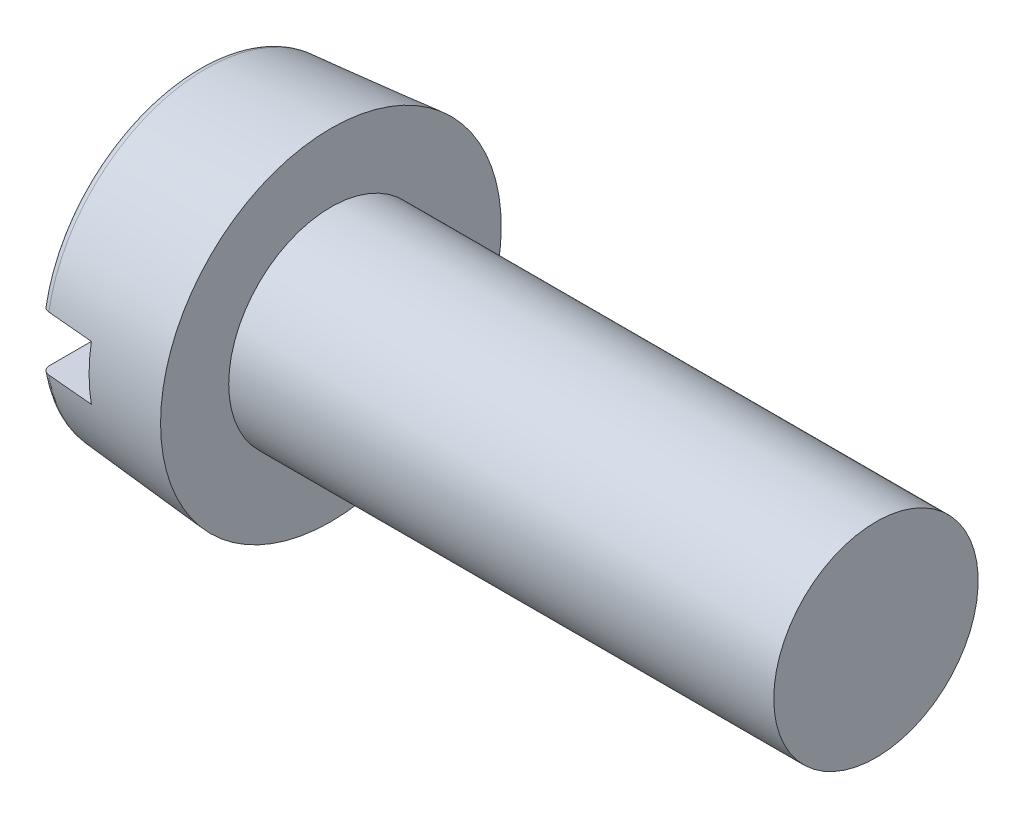
ISO-10303-21;
HEADER;
FILE_DESCRIPTION(('STEP AP214'),'2;1');
FILE_NAME('part.step','',(''),(''),'','','');
FILE_SCHEMA(('AUTOMOTIVE_DESIGN { 1 0 10303 214 1 1 1 1 }'));
ENDSEC;
DATA;
#1=APPLICATION_CONTEXT('core data for automotive mechanical design processes');
#2=APPLICATION_PROTOCOL_DEFINITION('international standard','automotive_design',2000,#1);
#3=PRODUCT_CONTEXT('',#1,'mechanical');
#4=PRODUCT('Part','Part','',(#3));
#5=PRODUCT_RELATED_PRODUCT_CATEGORY('part','',(#4));
#6=PRODUCT_DEFINITION_FORMATION('','',#4);
#7=PRODUCT_DEFINITION_CONTEXT('part definition',#1,'design');
#8=PRODUCT_DEFINITION('design','',#6,#7);
#9=PRODUCT_DEFINITION_SHAPE('','',#8);
#10=(LENGTH_UNIT() NAMED_UNIT(*) SI_UNIT(.MILLI.,.METRE.));
#11=(NAMED_UNIT(*) PLANE_ANGLE_UNIT() SI_UNIT($,.RADIAN.));
#12=(NAMED_UNIT(*) SI_UNIT($,.STERADIAN.) SOLID_ANGLE_UNIT());
#13=UNCERTAINTY_MEASURE_WITH_UNIT(LENGTH_MEASURE(1.E-05),#10,'distance_accuracy_value','');
#14=(GEOMETRIC_REPRESENTATION_CONTEXT(3) GLOBAL_UNCERTAINTY_ASSIGNED_CONTEXT((#13)) GLOBAL_UNIT_ASSIGNED_CONTEXT((#10,
#11,#12)) REPRESENTATION_CONTEXT('',''));
#15=CARTESIAN_POINT('',(0.,0.,0.));
#16=DIRECTION('',(0.,0.,1.));
#17=DIRECTION('',(1.,0.,0.));
#18=AXIS2_PLACEMENT_3D('',#15,#16,#17);
#19=CARTESIAN_POINT('',(0.,0.,0.));
#20=DIRECTION('',(-1.,0.,0.));
#21=DIRECTION('',(0.,0.,1.));
#22=AXIS2_PLACEMENT_3D('',#19,#20,#21);
#23=PLANE('',#22);
#24=DIRECTION('',(0.,0.,-1.));
#25=VECTOR('',#24,1.);
#26=CARTESIAN_POINT('',(0.,0.799999999999999,5.));
#27=LINE('',#26,#25);
#28=CARTESIAN_POINT('',(0.,0.799999999999999,4.35687310503253));
#29=VERTEX_POINT('',#28);
#30=CARTESIAN_POINT('',(0.,0.799999999999999,-4.35687310503253));
#31=VERTEX_POINT('',#30);
#32=EDGE_CURVE('E105',#29,#31,#27,.T.);
#33=ORIENTED_EDGE('',*,*,#32,.F.);
#34=CARTESIAN_POINT('',(0.,0.,0.));
#35=DIRECTION('',(-1.,0.,0.));
#36=DIRECTION('',(0.,0.,1.));
#37=AXIS2_PLACEMENT_3D('',#34,#35,#36);
#38=CIRCLE('',#37,4.42971141874454);
#39=EDGE_CURVE('E107',#29,#31,#38,.T.);
#40=ORIENTED_EDGE('',*,*,#39,.T.);
#41=EDGE_LOOP('',(#33,#40));
#42=FACE_BOUND('',#41,.T.);
#43=ADVANCED_FACE('F36',(#42),#23,.T.);
#44=CARTESIAN_POINT('',(0.25,0.,0.));
#45=DIRECTION('',(-1.,0.,0.));
#46=DIRECTION('',(0.,0.,1.));
#47=AXIS2_PLACEMENT_3D('',#44,#45,#46);
#48=TOROIDAL_SURFACE('',#47,4.42971141874454,0.25);
#49=CARTESIAN_POINT('',(0.0843745139673016,0.799999999999999,-4.54713884753507));
#50=CARTESIAN_POINT('',(0.0947664586995602,0.799999999999999,-4.55647032525832));
#51=CARTESIAN_POINT('',(0.105945556691333,0.799999999999999,-4.56493903416212));
#52=CARTESIAN_POINT('',(0.129572716117704,0.799999999999999,-4.57989140862462));
#53=CARTESIAN_POINT('',(0.142022072161515,0.799999999999999,-4.58637302150944));
#54=CARTESIAN_POINT('',(0.167836656476817,0.799999999999999,-4.59714683325514));
#55=CARTESIAN_POINT('',(0.181201893013989,0.799999999999999,-4.60143901235377));
#56=CARTESIAN_POINT('',(0.20846295764934,0.799999999999999,-4.60769903597875));
#57=CARTESIAN_POINT('',(0.222358659502298,0.799999999999999,-4.60966743002539));
#58=CARTESIAN_POINT('',(0.250184670786079,0.799999999999999,-4.61121508700367));
#59=CARTESIAN_POINT('',(0.264114057095527,0.799999999999999,-4.61081097718474));
#60=CARTESIAN_POINT('',(0.291706289815914,0.799999999999999,-4.60766484478998));
#61=CARTESIAN_POINT('',(0.305369133587018,0.799999999999999,-4.60492279907126));
#62=CARTESIAN_POINT('',(0.33201528451889,0.799999999999999,-4.59719244659683));
#63=CARTESIAN_POINT('',(0.344999823284425,0.799999999999999,-4.59220838100316));
#64=CARTESIAN_POINT('',(0.36995602218756,0.799999999999999,-4.58014586647358));
#65=CARTESIAN_POINT('',(0.381927659652834,0.799999999999999,-4.57306737067284));
#66=CARTESIAN_POINT('',(0.404612434873794,0.799999999999999,-4.55696870724489));
#67=CARTESIAN_POINT('',(0.415316087301104,0.799999999999999,-4.54793517957388));
#68=CARTESIAN_POINT('',(0.435079629465306,0.799999999999999,-4.52822088199051));
#69=CARTESIAN_POINT('',(0.444139418595433,0.799999999999999,-4.51754001133239));
#70=CARTESIAN_POINT('',(0.460489239519099,0.799999999999999,-4.49468258218373));
#71=CARTESIAN_POINT('',(0.467753926150522,0.799999999999999,-4.48248789714714));
#72=CARTESIAN_POINT('',(0.480167350703522,0.799999999999999,-4.45706552825457));
#73=CARTESIAN_POINT('',(0.485315918386262,0.799999999999999,-4.44383776139041));
#74=CARTESIAN_POINT('',(0.493428565915992,0.799999999999999,-4.41651528125603));
#75=CARTESIAN_POINT('',(0.496359238222009,0.799999999999999,-4.40241064489389));
#76=CARTESIAN_POINT('',(0.499837523289973,0.799999999999999,-4.37391034921859));
#77=CARTESIAN_POINT('',(0.500384976210146,0.799999999999999,-4.35951467045037));
#78=CARTESIAN_POINT('',(0.499078446804455,0.799999999999999,-4.33068498215024));
#79=CARTESIAN_POINT('',(0.497199920280432,0.799999999999999,-4.31625207858808));
#80=CARTESIAN_POINT('',(0.491048786733969,0.799999999999999,-4.28790520901004));
#81=CARTESIAN_POINT('',(0.48677612267996,0.799999999999999,-4.27399125536466));
#82=CARTESIAN_POINT('',(0.47594460281427,0.799999999999999,-4.24707147808806));
#83=CARTESIAN_POINT('',(0.4693841583704,0.799999999999999,-4.23406629305718));
#84=CARTESIAN_POINT('',(0.454151641913421,0.799999999999999,-4.20935689397773));
#85=CARTESIAN_POINT('',(0.445479657663901,0.799999999999999,-4.19765262588758));
#86=CARTESIAN_POINT('',(0.426358586950534,0.799999999999999,-4.17601044610535));
#87=CARTESIAN_POINT('',(0.41592848359485,0.799999999999999,-4.16605577092361));
#88=CARTESIAN_POINT('',(0.393519785112439,0.799999999999999,-4.14807567025203));
#89=CARTESIAN_POINT('',(0.381541338548615,0.799999999999999,-4.14005005988019));
#90=CARTESIAN_POINT('',(0.356595306086814,0.799999999999999,-4.12630319751251));
#91=CARTESIAN_POINT('',(0.343648161289385,0.799999999999999,-4.12054485264621));
#92=CARTESIAN_POINT('',(0.316960794982865,0.799999999999999,-4.11132354564935));
#93=CARTESIAN_POINT('',(0.303220653730743,0.799999999999999,-4.10786035167426));
#94=CARTESIAN_POINT('',(0.275571496586555,0.799999999999999,-4.10337797513435));
#95=CARTESIAN_POINT('',(0.261668611402135,0.799999999999999,-4.10232091647946));
#96=CARTESIAN_POINT('',(0.233884694824703,0.799999999999999,-4.10257279191194));
#97=CARTESIAN_POINT('',(0.220003662337756,0.799999999999999,-4.10388160353476));
#98=CARTESIAN_POINT('',(0.192750847226188,0.799999999999999,-4.10880691438427));
#99=CARTESIAN_POINT('',(0.17937635175152,0.799999999999999,-4.11240843459997));
#100=CARTESIAN_POINT('',(0.153416340687042,0.799999999999999,-4.1217924272919));
#101=CARTESIAN_POINT('',(0.140830838036522,0.799999999999999,-4.12757493552489));
#102=CARTESIAN_POINT('',(0.116718702845362,0.799999999999999,-4.14118635319511));
#103=CARTESIAN_POINT('',(0.105199031535416,0.799999999999999,-4.14902758560239));
#104=CARTESIAN_POINT('',(0.0836139601475573,0.799999999999999,-4.16650536788752));
#105=CARTESIAN_POINT('',(0.0735486675995981,0.799999999999999,-4.17614205039207));
#106=CARTESIAN_POINT('',(0.0549906068780776,0.799999999999999,-4.19709392533343));
#107=CARTESIAN_POINT('',(0.0465244660482462,0.799999999999999,-4.20843269854749));
#108=CARTESIAN_POINT('',(0.0315779805542522,0.799999999999999,-4.23235098665425));
#109=CARTESIAN_POINT('',(0.0250978218784058,0.799999999999999,-4.24493061760823));
#110=CARTESIAN_POINT('',(0.0141935733015743,0.799999999999999,-4.27120525538031));
#111=CARTESIAN_POINT('',(0.00980663137929339,0.799999999999999,-4.28491568506915));
#112=CARTESIAN_POINT('',(0.00336858262139434,0.799999999999999,-4.31287408475846));
#113=CARTESIAN_POINT('',(0.00131755321712989,0.799999999999999,-4.32712207256186));
#114=CARTESIAN_POINT('',(-0.000404743229666968,0.799999999999999,-4.35591815094775));
#115=CARTESIAN_POINT('',(-4.97415160945771E-05,0.799999999999999,-4.37046781945822));
#116=CARTESIAN_POINT('',(0.00309634160915894,0.799999999999999,-4.39930578468791));
#117=CARTESIAN_POINT('',(0.005888065533615,0.799999999999999,-4.41359401145582));
#118=CARTESIAN_POINT('',(0.0138414796333788,0.799999999999999,-4.44150971841821));
#119=CARTESIAN_POINT('',(0.019005534533352,0.799999999999999,-4.45513652429213));
#120=CARTESIAN_POINT('',(0.0315669495689906,0.799999999999999,-4.48130546011623));
#121=CARTESIAN_POINT('',(0.038961552999586,0.799999999999999,-4.49384890450362));
#122=CARTESIAN_POINT('',(0.0527483231198187,0.799999999999999,-4.51322888535915));
#123=CARTESIAN_POINT('',(0.0585453744336813,0.799999999999999,-4.52049608241621));
#124=CARTESIAN_POINT('',(0.0709038030597203,0.799999999999999,-4.53434893015065));
#125=CARTESIAN_POINT('',(0.0774651747689887,0.799999999999999,-4.54093458582347));
#126=CARTESIAN_POINT('',(0.0843745139673016,0.799999999999999,-4.54713884753507));
#127=B_SPLINE_CURVE_WITH_KNOTS('',3,(#49,#50,#51,#52,#53,#54,#55,#56,#57,#58,#59,#60,#61,#62,
#63,#64,#65,#66,#67,#68,#69,#70,#71,#72,#73,#74,#75,#76,#77,#78,#79,#80,#81,#82,#83,#84,#85,#86,
#87,#88,#89,#90,#91,#92,#93,#94,#95,#96,#97,#98,#99,#100,#101,#102,#103,#104,#105,#106,#107,
#108,#109,#110,#111,#112,#113,#114,#115,#116,#117,#118,#119,#120,#121,#122,#123,#124,#125,#126),
.UNSPECIFIED.,.T.,.F.,(4,2,2,2,2,2,2,2,2,2,2,2,2,2,2,2,2,2,2,2,2,2,2,2,2,2,2,2,2,2,2,2,2,2,2,2,
2,2,4),(0.,0.0418667869734222,0.0837766778115482,0.125686946929814,0.16758730327269,
0.209194360972177,0.250801830538735,0.292330921340791,0.333860941465457,0.375684268578897,
0.417510154476528,0.459896582852511,0.502286420490785,0.545302709439979,0.588321883433682,
0.631779721081862,0.675238593998068,0.718727704998099,0.762215008734482,0.805259756204676,
0.848300376610336,0.890604257880895,0.93290386517574,0.974532868910495,1.01615971786478,
1.05751735778502,1.0988756757831,1.1404874327479,1.18210226471861,1.22435848197869,
1.26661865534824,1.30960322784671,1.35258922516599,1.39604528862763,1.43951281400867,
1.48302376187616,1.52648115394825,1.55431751761326,1.58215367723456),.UNSPECIFIED.);
#128=CARTESIAN_POINT('',(0.228211064313089,0.799999999999999,-4.60985856728298));
#129=VERTEX_POINT('',#128);
#130=EDGE_CURVE('E60',#31,#129,#127,.T.);
#131=ORIENTED_EDGE('',*,*,#130,.F.);
#132=ORIENTED_EDGE('',*,*,#39,.F.);
#133=CARTESIAN_POINT('',(0.0959001813107435,0.799999999999999,4.15656641103332));
#134=CARTESIAN_POINT('',(0.106788415825711,0.799999999999999,4.14788745461773));
#135=CARTESIAN_POINT('',(0.118407944179667,0.799999999999999,4.14011141325745));
#136=CARTESIAN_POINT('',(0.142793418088751,0.799999999999999,4.12660779391372));
#137=CARTESIAN_POINT('',(0.1555604916501,0.799999999999999,4.1208822596904));
#138=CARTESIAN_POINT('',(0.181880372778501,0.799999999999999,4.11166457290373));
#139=CARTESIAN_POINT('',(0.195433261558838,0.799999999999999,4.10817265163254));
#140=CARTESIAN_POINT('',(0.22293177574204,0.799999999999999,4.10353646607757));
#141=CARTESIAN_POINT('',(0.236877307119585,0.799999999999999,4.10239164450505));
#142=CARTESIAN_POINT('',(0.264645946049344,0.799999999999999,4.10248426879624));
#143=CARTESIAN_POINT('',(0.278469121771725,0.799999999999999,4.10370230145962));
#144=CARTESIAN_POINT('',(0.305714231255908,0.799999999999999,4.10844337723671));
#145=CARTESIAN_POINT('',(0.319136158921659,0.799999999999999,4.11196645535176));
#146=CARTESIAN_POINT('',(0.345196190898692,0.799999999999999,4.12120519851656));
#147=CARTESIAN_POINT('',(0.357834594953027,0.799999999999999,4.12692001901016));
#148=CARTESIAN_POINT('',(0.381987358781024,0.799999999999999,4.14036736287849));
#149=CARTESIAN_POINT('',(0.393501667695256,0.799999999999999,4.14809997748976));
#150=CARTESIAN_POINT('',(0.415223323770805,0.799999999999999,4.16545218138983));
#151=CARTESIAN_POINT('',(0.425414331301238,0.799999999999999,4.1750922160513));
#152=CARTESIAN_POINT('',(0.444067043476819,0.799999999999999,4.19592046549653));
#153=CARTESIAN_POINT('',(0.452528600639199,0.799999999999999,4.20710881217976));
#154=CARTESIAN_POINT('',(0.467637257703406,0.799999999999999,4.23092308558754));
#155=CARTESIAN_POINT('',(0.474250444884052,0.799999999999999,4.24357052897649));
#156=CARTESIAN_POINT('',(0.485295923870393,0.799999999999999,4.26978437529861));
#157=CARTESIAN_POINT('',(0.489728024878825,0.799999999999999,4.28335085850958));
#158=CARTESIAN_POINT('',(0.496348686228484,0.799999999999999,4.31123668386873));
#159=CARTESIAN_POINT('',(0.498502538073368,0.799999999999999,4.32556427489857));
#160=CARTESIAN_POINT('',(0.500390966396856,0.799999999999999,4.35437836821249));
#161=CARTESIAN_POINT('',(0.500125424907182,0.799999999999999,4.36886487821098));
#162=CARTESIAN_POINT('',(0.49716991446228,0.799999999999999,4.39768046074187));
#163=CARTESIAN_POINT('',(0.494464847017555,0.799999999999999,4.41200798953149));
#164=CARTESIAN_POINT('',(0.48667671393226,0.799999999999999,4.44000204463693));
#165=CARTESIAN_POINT('',(0.481593671098545,0.799999999999999,4.45366857729088));
#166=CARTESIAN_POINT('',(0.469211071617953,0.799999999999999,4.47988055882434));
#167=CARTESIAN_POINT('',(0.461921932889214,0.799999999999999,4.49243092577483));
#168=CARTESIAN_POINT('',(0.445314277109358,0.799999999999999,4.51610885304479));
#169=CARTESIAN_POINT('',(0.435995887681564,0.799999999999999,4.52723650277175));
#170=CARTESIAN_POINT('',(0.415719339948153,0.799999999999999,4.54759847674213));
#171=CARTESIAN_POINT('',(0.40478366018556,0.799999999999999,4.55685518051455));
#172=CARTESIAN_POINT('',(0.381493322866437,0.799999999999999,4.57336755721764));
#173=CARTESIAN_POINT('',(0.369138787325294,0.799999999999999,4.58062340203119));
#174=CARTESIAN_POINT('',(0.343562076099289,0.799999999999999,4.59281384530927));
#175=CARTESIAN_POINT('',(0.330355796776961,0.799999999999999,4.59778180297204));
#176=CARTESIAN_POINT('',(0.303291234624968,0.799999999999999,4.60540157532454));
#177=CARTESIAN_POINT('',(0.289432998788489,0.799999999999999,4.60805355668166));
#178=CARTESIAN_POINT('',(0.261624724399412,0.799999999999999,4.61094190214969));
#179=CARTESIAN_POINT('',(0.247677460008665,0.799999999999999,4.61120503296629));
#180=CARTESIAN_POINT('',(0.219938315263379,0.799999999999999,4.60937765777905));
#181=CARTESIAN_POINT('',(0.206146430136893,0.799999999999999,4.60728722425708));
#182=CARTESIAN_POINT('',(0.179153987168141,0.799999999999999,4.60082770933504));
#183=CARTESIAN_POINT('',(0.165951690867308,0.799999999999999,4.59646588382979));
#184=CARTESIAN_POINT('',(0.140460643506912,0.799999999999999,4.58560026694177));
#185=CARTESIAN_POINT('',(0.128171907706466,0.799999999999999,4.57909643979119));
#186=CARTESIAN_POINT('',(0.10477557572249,0.799999999999999,4.56409626270254));
#187=CARTESIAN_POINT('',(0.0936753626978237,0.799999999999999,4.55558840254583));
#188=CARTESIAN_POINT('',(0.0730382927080419,0.799999999999999,4.53685140871141));
#189=CARTESIAN_POINT('',(0.0635015296880057,0.799999999999999,4.52662217167386));
#190=CARTESIAN_POINT('',(0.0461300651497456,0.799999999999999,4.50459510365438));
#191=CARTESIAN_POINT('',(0.0383186413286125,0.799999999999999,4.49277891845132));
#192=CARTESIAN_POINT('',(0.0247564031853251,0.799999999999999,4.46801811991763));
#193=CARTESIAN_POINT('',(0.0190057551793424,0.799999999999999,4.45507341561395));
#194=CARTESIAN_POINT('',(0.00963931307658738,0.799999999999999,4.42821566315949));
#195=CARTESIAN_POINT('',(0.00605674159024491,0.799999999999999,4.41429102608576));
#196=CARTESIAN_POINT('',(0.0012515332492651,0.799999999999999,4.38604074185308));
#197=CARTESIAN_POINT('',(2.8974540943668E-05,0.799999999999999,4.37171508143111));
#198=CARTESIAN_POINT('',(-2.82690076872439E-05,0.799999999999999,4.34289966366282));
#199=CARTESIAN_POINT('',(0.00116367190061409,0.799999999999999,4.32840984797728));
#200=CARTESIAN_POINT('',(0.00595761948908729,0.799999999999999,4.29983005095994));
#201=CARTESIAN_POINT('',(0.00956028797955093,0.799999999999999,4.28574018053154));
#202=CARTESIAN_POINT('',(0.0190939091140281,0.799999999999999,4.25832934268385));
#203=CARTESIAN_POINT('',(0.0250311218028103,0.799999999999999,4.24501055399625));
#204=CARTESIAN_POINT('',(0.0390730747089435,0.799999999999999,4.21958282568064));
#205=CARTESIAN_POINT('',(0.0471751672784287,0.799999999999999,4.20747243286742));
#206=CARTESIAN_POINT('',(0.0620951603544308,0.799999999999999,4.1888427296012));
#207=CARTESIAN_POINT('',(0.0683488441377469,0.799999999999999,4.18186415048199));
#208=CARTESIAN_POINT('',(0.0815915898531068,0.799999999999999,4.1686431762696));
#209=CARTESIAN_POINT('',(0.0885806460321473,0.799999999999999,4.16240077541792));
#210=CARTESIAN_POINT('',(0.0959001813107435,0.799999999999999,4.15656641103332));
#211=B_SPLINE_CURVE_WITH_KNOTS('',3,(#133,#134,#135,#136,#137,#138,#139,#140,#141,#142,#143,
#144,#145,#146,#147,#148,#149,#150,#151,#152,#153,#154,#155,#156,#157,#158,#159,#160,#161,#162,
#163,#164,#165,#166,#167,#168,#169,#170,#171,#172,#173,#174,#175,#176,#177,#178,#179,#180,#181,
#182,#183,#184,#185,#186,#187,#188,#189,#190,#191,#192,#193,#194,#195,#196,#197,#198,#199,#200,
#201,#202,#203,#204,#205,#206,#207,#208,#209,#210),.UNSPECIFIED.,.T.,.F.,(4,2,2,2,2,2,2,2,2,2,2,
2,2,2,2,2,2,2,2,2,2,2,2,2,2,2,2,2,2,2,2,2,2,2,2,2,2,2,4),(0.,0.0417385272571555,
0.0835185406796224,0.125302879751477,0.167077296518138,0.208509948086357,0.249943228809956,
0.291360559834956,0.332779763910084,0.374669665166324,0.416563137188986,0.45918117047002,
0.501802931232992,0.545065061503765,0.588329301223336,0.631863159585299,0.675396600428199,
0.718727587294531,0.762055849781762,0.804830369249996,0.847601213047327,0.889726974282855,
0.931849703721539,0.973499863801072,1.01514874123079,1.0566653813861,1.09818271483433,
1.13994458301147,1.18170895966993,1.22400639230702,1.26630723781588,1.30924087081592,
1.35217592543865,1.39558702078537,1.43901003855051,1.48255029735413,1.52603754824063,
1.55409618457985,1.58215460142562),.UNSPECIFIED.);
#212=CARTESIAN_POINT('',(0.228211064304484,0.799999999999999,4.60985856731615));
#213=VERTEX_POINT('',#212);
#214=EDGE_CURVE('E97',#213,#29,#211,.T.);
#215=ORIENTED_EDGE('',*,*,#214,.F.);
#216=CARTESIAN_POINT('',(0.228211064313089,0.,0.));
#217=DIRECTION('',(-1.,0.,0.));
#218=DIRECTION('',(0.,0.,1.));
#219=AXIS2_PLACEMENT_3D('',#216,#217,#218);
#220=CIRCLE('',#219,4.67876009326748);
#221=EDGE_CURVE('E111',#129,#213,#220,.F.);
#222=ORIENTED_EDGE('',*,*,#221,.F.);
#223=EDGE_LOOP('',(#131,#132,#215,#222));
#224=FACE_BOUND('',#223,.T.);
#225=ADVANCED_FACE('F188',(#224),#48,.T.);
#226=CARTESIAN_POINT('',(-25.4,0.,0.));
#227=DIRECTION('',(-1.,0.,0.));
#228=DIRECTION('',(0.,0.,1.));
#229=AXIS2_PLACEMENT_3D('',#226,#227,#228);
#230=CYLINDRICAL_SURFACE('',#229,3.);
#231=CARTESIAN_POINT('',(19.9,0.,0.));
#232=DIRECTION('',(-1.,0.,0.));
#233=DIRECTION('',(0.,0.,1.));
#234=AXIS2_PLACEMENT_3D('',#231,#232,#233);
#235=CIRCLE('',#234,3.);
#236=CARTESIAN_POINT('',(19.9,0.,3.));
#237=VERTEX_POINT('',#236);
#238=EDGE_CURVE('E108',#237,#237,#235,.T.);
#239=ORIENTED_EDGE('',*,*,#238,.T.);
#240=EDGE_LOOP('',(#239));
#241=FACE_BOUND('',#240,.T.);
#242=CARTESIAN_POINT('',(3.9,0.,0.));
#243=DIRECTION('',(-1.,0.,0.));
#244=DIRECTION('',(0.,0.,1.));
#245=AXIS2_PLACEMENT_3D('',#242,#243,#244);
#246=CIRCLE('',#245,3.);
#247=CARTESIAN_POINT('',(3.9,0.,3.));
#248=VERTEX_POINT('',#247);
#249=EDGE_CURVE('E175',#248,#248,#246,.T.);
#250=ORIENTED_EDGE('',*,*,#249,.F.);
#251=EDGE_LOOP('',(#250));
#252=FACE_BOUND('',#251,.T.);
#253=ADVANCED_FACE('F185',(#241,#252),#230,.T.);
#254=CARTESIAN_POINT('',(19.9,3.,0.));
#255=DIRECTION('',(1.,0.,0.));
#256=DIRECTION('',(0.,0.,-1.));
#257=AXIS2_PLACEMENT_3D('',#254,#255,#256);
#258=PLANE('',#257);
#259=ORIENTED_EDGE('',*,*,#238,.F.);
#260=EDGE_LOOP('',(#259));
#261=FACE_BOUND('',#260,.T.);
#262=ADVANCED_FACE('F187',(#261),#258,.T.);
#263=DIRECTION('',(0.,0.,1.));
#264=VECTOR('',#263,1.);
#265=CARTESIAN_POINT('',(0.,-0.799999999999999,-5.));
#266=LINE('',#265,#264);
#267=CARTESIAN_POINT('',(0.,-0.799999999999999,-4.35687310503253));
#268=VERTEX_POINT('',#267);
#269=CARTESIAN_POINT('',(0.,-0.8,4.35687310503253));
#270=VERTEX_POINT('',#269);
#271=EDGE_CURVE('E52',#268,#270,#266,.T.);
#272=ORIENTED_EDGE('',*,*,#271,.F.);
#273=EDGE_CURVE('E103',#268,#270,#38,.T.);
#274=ORIENTED_EDGE('',*,*,#273,.T.);
#275=EDGE_LOOP('',(#272,#274));
#276=FACE_BOUND('',#275,.T.);
#277=ADVANCED_FACE('F102',(#276),#23,.T.);
#278=CARTESIAN_POINT('',(0.,0.,0.));
#279=DIRECTION('',(1.,0.,0.));
#280=DIRECTION('',(0.,0.,-1.));
#281=AXIS2_PLACEMENT_3D('',#278,#279,#280);
#282=CONICAL_SURFACE('',#281,4.6587942122489,0.0872664625997167);
#283=CARTESIAN_POINT('',(-7.83789335953312,0.799999999999999,-3.89169173291022));
#284=CARTESIAN_POINT('',(-5.41118297835816,0.799999999999999,-4.10841107343651));
#285=CARTESIAN_POINT('',(-2.98441411167057,0.799999999999999,-4.32447366678877));
#286=CARTESIAN_POINT('',(-0.0942674590411005,0.799999999999999,-4.58122706535115));
#287=CARTESIAN_POINT('',(0.369070013582565,0.799999999999999,-4.62237151023648));
#288=CARTESIAN_POINT('',(3.72257379521685,0.799999999999999,-4.92004745581368));
#289=CARTESIAN_POINT('',(6.6127935265636,0.799999999999999,-5.17597743856718));
#290=CARTESIAN_POINT('',(9.50303997107882,0.799999999999999,-5.43160411459587));
#291=B_SPLINE_CURVE_WITH_KNOTS('',3,(#283,#284,#285,#286,#287,#288,#289,#290),.UNSPECIFIED.,.F.,
.F.,(4,2,2,4),(0.,7.30910461600096,8.70458672170068,17.4091732739788),.UNSPECIFIED.);
#292=CARTESIAN_POINT('',(1.6,0.799999999999999,-4.73162253432612));
#293=VERTEX_POINT('',#292);
#294=EDGE_CURVE('E169',#129,#293,#291,.T.);
#295=ORIENTED_EDGE('',*,*,#294,.F.);
#296=ORIENTED_EDGE('',*,*,#221,.T.);
#297=CARTESIAN_POINT('',(9.50303997107882,0.799999999999999,5.43160411459587));
#298=CARTESIAN_POINT('',(8.05791538395331,0.799999999999999,5.30380564458647));
#299=CARTESIAN_POINT('',(6.61279876380446,0.799999999999999,5.17591699640387));
#300=CARTESIAN_POINT('',(3.72258668490658,0.799999999999999,4.91990157794229));
#301=CARTESIAN_POINT('',(2.27749122615658,0.799999999999999,4.79177480767424));
#302=CARTESIAN_POINT('',(-0.61267346515448,0.799999999999999,4.53522536490807));
#303=CARTESIAN_POINT('',(-2.05774269771499,0.799999999999999,4.40680269240383));
#304=CARTESIAN_POINT('',(-4.94784633046135,0.799999999999999,4.14956529110288));
#305=CARTESIAN_POINT('',(-6.39288073064557,0.799999999999999,4.02075056228802));
#306=CARTESIAN_POINT('',(-7.83789335953312,0.799999999999999,3.89169173291022));
#307=B_SPLINE_CURVE_WITH_KNOTS('',3,(#297,#298,#299,#300,#301,#302,#303,#304,#305,#306),
.UNSPECIFIED.,.F.,.F.,(4,2,2,2,4),(0.,4.35229339088454,8.70458658182285,13.056879862745,
17.4091733453214),.UNSPECIFIED.);
#308=CARTESIAN_POINT('',(1.6,0.799999999999999,4.73162253432612));
#309=VERTEX_POINT('',#308);
#310=EDGE_CURVE('E164',#309,#213,#307,.T.);
#311=ORIENTED_EDGE('',*,*,#310,.F.);
#312=CARTESIAN_POINT('',(1.6,0.,0.));
#313=DIRECTION('',(-1.,0.,0.));
#314=DIRECTION('',(0.,0.,1.));
#315=AXIS2_PLACEMENT_3D('',#312,#313,#314);
#316=CIRCLE('',#315,4.79877607389037);
#317=CARTESIAN_POINT('',(1.6,-0.800000000000001,4.73162253432612));
#318=VERTEX_POINT('',#317);
#319=EDGE_CURVE('E41',#309,#318,#316,.F.);
#320=ORIENTED_EDGE('',*,*,#319,.T.);
#321=CARTESIAN_POINT('',(-7.83789335953312,-0.8,3.89169173291022));
#322=CARTESIAN_POINT('',(-5.41118297835816,-0.8,4.10841107343651));
#323=CARTESIAN_POINT('',(-2.98441411167057,-0.8,4.32447366678877));
#324=CARTESIAN_POINT('',(-0.0942674590411004,-0.8,4.58122706535115));
#325=CARTESIAN_POINT('',(0.369070013582565,-0.800000000000001,4.62237151023648));
#326=CARTESIAN_POINT('',(3.72257379521685,-0.800000000000001,4.92004745581368));
#327=CARTESIAN_POINT('',(6.6127935265636,-0.800000000000001,5.17597743856718));
#328=CARTESIAN_POINT('',(9.50303997107882,-0.800000000000001,5.43160411459587));
#329=B_SPLINE_CURVE_WITH_KNOTS('',3,(#321,#322,#323,#324,#325,#326,#327,#328),.UNSPECIFIED.,.F.,
.F.,(4,2,2,4),(0.,7.30910461600096,8.70458672170068,17.4091732739788),.UNSPECIFIED.);
#330=CARTESIAN_POINT('',(0.228211064313089,-0.800000000000001,4.60985856728298));
#331=VERTEX_POINT('',#330);
#332=EDGE_CURVE('E140',#331,#318,#329,.T.);
#333=ORIENTED_EDGE('',*,*,#332,.F.);
#334=CARTESIAN_POINT('',(0.228211064312738,-0.799999999999999,-4.60985856728456));
#335=VERTEX_POINT('',#334);
#336=EDGE_CURVE('E117',#331,#335,#220,.F.);
#337=ORIENTED_EDGE('',*,*,#336,.T.);
#338=CARTESIAN_POINT('',(9.50303997107882,-0.799999999999999,-5.43160411459587));
#339=CARTESIAN_POINT('',(8.05791538395331,-0.799999999999999,-5.30380564458647));
#340=CARTESIAN_POINT('',(6.61279876380446,-0.799999999999999,-5.17591699640387));
#341=CARTESIAN_POINT('',(3.72258668490658,-0.799999999999999,-4.91990157794229));
#342=CARTESIAN_POINT('',(2.27749122615658,-0.799999999999999,-4.79177480767424));
#343=CARTESIAN_POINT('',(-0.61267346515448,-0.799999999999999,-4.53522536490807));
#344=CARTESIAN_POINT('',(-2.05774269771499,-0.799999999999999,-4.40680269240383));
#345=CARTESIAN_POINT('',(-4.94784633046135,-0.799999999999999,-4.14956529110288));
#346=CARTESIAN_POINT('',(-6.39288073064557,-0.799999999999999,-4.02075056228801));
#347=CARTESIAN_POINT('',(-7.83789335953312,-0.799999999999999,-3.89169173291022));
#348=B_SPLINE_CURVE_WITH_KNOTS('',3,(#338,#339,#340,#341,#342,#343,#344,#345,#346,#347),
.UNSPECIFIED.,.F.,.F.,(4,2,2,2,4),(0.,4.35229339088454,8.70458658182285,13.056879862745,
17.4091733453214),.UNSPECIFIED.);
#349=CARTESIAN_POINT('',(1.6,-0.799999999999999,-4.73162253432612));
#350=VERTEX_POINT('',#349);
#351=EDGE_CURVE('E92',#350,#335,#348,.T.);
#352=ORIENTED_EDGE('',*,*,#351,.F.);
#353=EDGE_CURVE('E11',#350,#293,#316,.F.);
#354=ORIENTED_EDGE('',*,*,#353,.T.);
#355=EDGE_LOOP('',(#295,#296,#311,#320,#333,#337,#352,#354));
#356=FACE_BOUND('',#355,.T.);
#357=CARTESIAN_POINT('',(3.9,0.,0.));
#358=DIRECTION('',(-1.,0.,0.));
#359=DIRECTION('',(0.,0.,1.));
#360=AXIS2_PLACEMENT_3D('',#357,#358,#359);
#361=CIRCLE('',#360,5.);
#362=CARTESIAN_POINT('',(3.9,0.,5.));
#363=VERTEX_POINT('',#362);
#364=EDGE_CURVE('E113',#363,#363,#361,.T.);
#365=ORIENTED_EDGE('',*,*,#364,.T.);
#366=EDGE_LOOP('',(#365));
#367=FACE_BOUND('',#366,.T.);
#368=ADVANCED_FACE('F153',(#356,#367),#282,.T.);
#369=CARTESIAN_POINT('',(3.9,3.,0.));
#370=DIRECTION('',(-1.,0.,0.));
#371=DIRECTION('',(0.,0.,1.));
#372=AXIS2_PLACEMENT_3D('',#369,#370,#371);
#373=PLANE('',#372);
#374=ORIENTED_EDGE('',*,*,#364,.F.);
#375=EDGE_LOOP('',(#374));
#376=FACE_BOUND('',#375,.T.);
#377=ORIENTED_EDGE('',*,*,#249,.T.);
#378=EDGE_LOOP('',(#377));
#379=FACE_BOUND('',#378,.T.);
#380=ADVANCED_FACE('F157',(#376,#379),#373,.F.);
#381=CARTESIAN_POINT('',(0.0843745139673023,-0.799999999999999,-4.54713884753507));
#382=CARTESIAN_POINT('',(0.0737603357445726,-0.799999999999999,-4.53760610503184));
#383=CARTESIAN_POINT('',(0.0639520071787505,-0.799999999999999,-4.52715900682901));
#384=CARTESIAN_POINT('',(0.0462273890176086,-0.799999999999999,-4.50475208673621));
#385=CARTESIAN_POINT('',(0.0383137488678715,-0.799999999999999,-4.49279018191168));
#386=CARTESIAN_POINT('',(0.0246066117626895,-0.799999999999999,-4.46772423180876));
#387=CARTESIAN_POINT('',(0.0188107945212317,-0.799999999999999,-4.45462145608295));
#388=CARTESIAN_POINT('',(0.00947759683129601,-0.799999999999999,-4.42763988927154));
#389=CARTESIAN_POINT('',(0.00593964544219291,-0.799999999999999,-4.41376129533123));
#390=CARTESIAN_POINT('',(0.00118177338242992,-0.799999999999999,-4.38546474893509));
#391=CARTESIAN_POINT('',(-1.38480967066959E-05,-0.799999999999999,-4.37104270836971));
#392=CARTESIAN_POINT('',(1.4093385631098E-05,-0.799999999999999,-4.34219994883412));
#393=CARTESIAN_POINT('',(0.00123789649777612,-0.799999999999999,-4.3277792301372));
#394=CARTESIAN_POINT('',(0.0060894668219835,-0.799999999999999,-4.29924106440771));
#395=CARTESIAN_POINT('',(0.00973437470289415,-0.799999999999999,-4.28512652617005));
#396=CARTESIAN_POINT('',(0.0193496793369987,-0.799999999999999,-4.25771245501592));
#397=CARTESIAN_POINT('',(0.0253200741493885,-0.799999999999999,-4.24441292141927));
#398=CARTESIAN_POINT('',(0.0394045267852928,-0.799999999999999,-4.21906013851943));
#399=CARTESIAN_POINT('',(0.0475112533983079,-0.799999999999999,-4.20700281949146));
#400=CARTESIAN_POINT('',(0.0656595505425879,-0.799999999999999,-4.18444400348104));
#401=CARTESIAN_POINT('',(0.0757009909618365,-0.799999999999999,-4.17394240195854));
#402=CARTESIAN_POINT('',(0.0972927480358149,-0.799999999999999,-4.15494887646996));
#403=CARTESIAN_POINT('',(0.108820932355403,-0.799999999999999,-4.14643180130556));
#404=CARTESIAN_POINT('',(0.133164607149342,-0.799999999999999,-4.13149520076724));
#405=CARTESIAN_POINT('',(0.145979964226231,-0.799999999999999,-4.12507545832674));
#406=CARTESIAN_POINT('',(0.172290042899435,-0.799999999999999,-4.11463454030796));
#407=CARTESIAN_POINT('',(0.185768700984131,-0.799999999999999,-4.1105728756715));
#408=CARTESIAN_POINT('',(0.213220594351409,-0.799999999999999,-4.10480407955907));
#409=CARTESIAN_POINT('',(0.227193785766066,-0.799999999999999,-4.10309673977531));
#410=CARTESIAN_POINT('',(0.255041044481314,-0.799999999999999,-4.10209843590767));
#411=CARTESIAN_POINT('',(0.268913990511187,-0.799999999999999,-4.10277591696756));
#412=CARTESIAN_POINT('',(0.296347583234289,-0.799999999999999,-4.10645554171541));
#413=CARTESIAN_POINT('',(0.309908238284468,-0.799999999999999,-4.10945762312214));
#414=CARTESIAN_POINT('',(0.336309180754015,-0.799999999999999,-4.11768381832594));
#415=CARTESIAN_POINT('',(0.34915076820688,-0.799999999999999,-4.12290376520291));
#416=CARTESIAN_POINT('',(0.373787736065719,-0.799999999999999,-4.13540436122518));
#417=CARTESIAN_POINT('',(0.385583074001631,-0.799999999999999,-4.14268509397305));
#418=CARTESIAN_POINT('',(0.407925919580577,-0.799999999999999,-4.15917419585865));
#419=CARTESIAN_POINT('',(0.41845944449669,-0.799999999999999,-4.16840150246709));
#420=CARTESIAN_POINT('',(0.4378599888426,-0.799999999999999,-4.18846687448173));
#421=CARTESIAN_POINT('',(0.446726868155156,-0.799999999999999,-4.19930507518102));
#422=CARTESIAN_POINT('',(0.462703133718901,-0.799999999999999,-4.22248150604922));
#423=CARTESIAN_POINT('',(0.46978003356885,-0.799999999999999,-4.23484213002085));
#424=CARTESIAN_POINT('',(0.481795419763136,-0.799999999999999,-4.2605623072919));
#425=CARTESIAN_POINT('',(0.486733716693506,-0.799999999999999,-4.27392194895051));
#426=CARTESIAN_POINT('',(0.494407148657097,-0.799999999999999,-4.30148614776211));
#427=CARTESIAN_POINT('',(0.497106517568064,-0.799999999999999,-4.31570066971288));
#428=CARTESIAN_POINT('',(0.500100299383065,-0.799999999999999,-4.34438108535859));
#429=CARTESIAN_POINT('',(0.50039457914615,-0.799999999999999,-4.35884699292532));
#430=CARTESIAN_POINT('',(0.49856128724278,-0.799999999999999,-4.38773348859548));
#431=CARTESIAN_POINT('',(0.496415658938676,-0.799999999999999,-4.40215293644245));
#432=CARTESIAN_POINT('',(0.489725914059799,-0.799999999999999,-4.43042483658793));
#433=CARTESIAN_POINT('',(0.485181806547874,-0.799999999999999,-4.44427729102866));
#434=CARTESIAN_POINT('',(0.47383222860232,-0.799999999999999,-4.47096677908084));
#435=CARTESIAN_POINT('',(0.467034625038915,-0.799999999999999,-4.48380715546101));
#436=CARTESIAN_POINT('',(0.451354973088111,-0.799999999999999,-4.50814567951741));
#437=CARTESIAN_POINT('',(0.442473041372824,-0.799999999999999,-4.51964390226796));
#438=CARTESIAN_POINT('',(0.422988960410329,-0.799999999999999,-4.54081982710346));
#439=CARTESIAN_POINT('',(0.412408941266047,-0.799999999999999,-4.55051788604062));
#440=CARTESIAN_POINT('',(0.389749305196081,-0.799999999999999,-4.5679671083508));
#441=CARTESIAN_POINT('',(0.377669813182915,-0.799999999999999,-4.57571843373265));
#442=CARTESIAN_POINT('',(0.352550786436499,-0.799999999999999,-4.58893078670692));
#443=CARTESIAN_POINT('',(0.339528542753451,-0.799999999999999,-4.59442469272203));
#444=CARTESIAN_POINT('',(0.312740076892846,-0.799999999999999,-4.60311798708096));
#445=CARTESIAN_POINT('',(0.298973941024189,-0.799999999999999,-4.60631764099966));
#446=CARTESIAN_POINT('',(0.271266014940124,-0.799999999999999,-4.6102982518588));
#447=CARTESIAN_POINT('',(0.257328333190502,-0.799999999999999,-4.61110785696998));
#448=CARTESIAN_POINT('',(0.229512502251651,-0.799999999999999,-4.61036457948427));
#449=CARTESIAN_POINT('',(0.215634366779786,-0.799999999999999,-4.60881117905814));
#450=CARTESIAN_POINT('',(0.188390679100956,-0.799999999999999,-4.60340035154744));
#451=CARTESIAN_POINT('',(0.175023407099438,-0.799999999999999,-4.59955154543945));
#452=CARTESIAN_POINT('',(0.149132374206726,-0.799999999999999,-4.58967634050166));
#453=CARTESIAN_POINT('',(0.136607605231208,-0.799999999999999,-4.58365260108779));
#454=CARTESIAN_POINT('',(0.11748854388146,-0.799999999999999,-4.57240950415919));
#455=CARTESIAN_POINT('',(0.110515086065581,-0.799999999999999,-4.56782140861047));
#456=CARTESIAN_POINT('',(0.0970607801410406,-0.799999999999999,-4.55797266270536));
#457=CARTESIAN_POINT('',(0.0905799283722514,-0.799999999999999,-4.55271201734689));
#458=CARTESIAN_POINT('',(0.0843745139673023,-0.799999999999999,-4.54713884753507));
#459=B_SPLINE_CURVE_WITH_KNOTS('',3,(#381,#382,#383,#384,#385,#386,#387,#388,#389,#390,#391,
#392,#393,#394,#395,#396,#397,#398,#399,#400,#401,#402,#403,#404,#405,#406,#407,#408,#409,#410,
#411,#412,#413,#414,#415,#416,#417,#418,#419,#420,#421,#422,#423,#424,#425,#426,#427,#428,#429,
#430,#431,#432,#433,#434,#435,#436,#437,#438,#439,#440,#441,#442,#443,#444,#445,#446,#447,#448,
#449,#450,#451,#452,#453,#454,#455,#456,#457,#458),.UNSPECIFIED.,.T.,.F.,(4,2,2,2,2,2,2,2,2,2,2,
2,2,2,2,2,2,2,2,2,2,2,2,2,2,2,2,2,2,2,2,2,2,2,2,2,2,2,4),(0.,0.0427685963661013,
0.0855966535763518,0.12837764668788,0.171147817590854,0.214359382277732,0.25757523633461,
0.301100353377304,0.344625434094898,0.388003052859768,0.431377755441023,0.474168545856068,
0.516954906170772,0.558983047991637,0.601007470975107,0.642477948077823,0.683947314132081,
0.725339109788855,0.766732584880943,0.808549042826819,0.850369014770261,0.892900870431806,
0.935436492328133,0.978639188261659,1.02184427579425,1.06537119691043,1.10889795355779,
1.15227433250908,1.19564828400807,1.2384970729962,1.28134229488895,1.3235392555169,
1.36573133077808,1.40741557766796,1.44910896056351,1.49064673090553,1.53213388168679,
1.55713806293772,1.58214205838613),.UNSPECIFIED.);
#460=EDGE_CURVE('E88',#335,#268,#459,.T.);
#461=ORIENTED_EDGE('',*,*,#460,.F.);
#462=ORIENTED_EDGE('',*,*,#336,.F.);
#463=CARTESIAN_POINT('',(0.0959001813107431,-0.8,4.15656641103332));
#464=CARTESIAN_POINT('',(0.0847377896666591,-0.8,4.1654655129561));
#465=CARTESIAN_POINT('',(0.0743278262845266,-0.8,4.17532695864081));
#466=CARTESIAN_POINT('',(0.0553096174972414,-0.8,4.19667228407554));
#467=CARTESIAN_POINT('',(0.0467039604366338,-0.8,4.20815845555826));
#468=CARTESIAN_POINT('',(0.0315428610072235,-0.8,4.2323943240607));
#469=CARTESIAN_POINT('',(0.0249850425736757,-0.8,4.24514253396405));
#470=CARTESIAN_POINT('',(0.0140778052621232,-0.8,4.27154582366864));
#471=CARTESIAN_POINT('',(0.00972781298695448,-0.8,4.28520066696418));
#472=CARTESIAN_POINT('',(0.00330793948593111,-0.8,4.31319632146552));
#473=CARTESIAN_POINT('',(0.0012639172270261,-0.8,4.32754306671971));
#474=CARTESIAN_POINT('',(-0.000402723019294893,-0.8,4.3563776036531));
#475=CARTESIAN_POINT('',(-2.51133673605528E-05,-0.8,4.37086540846444));
#476=CARTESIAN_POINT('',(0.00315440747099801,-0.8,4.39966111186127));
#477=CARTESIAN_POINT('',(0.00597082302089405,-0.8,4.41396741351832));
#478=CARTESIAN_POINT('',(0.0139770551970604,-0.8,4.44190028859587));
#479=CARTESIAN_POINT('',(0.0191668405036659,-0.8,4.4555268709835));
#480=CARTESIAN_POINT('',(0.0317533592436885,-0.8,4.481638182444));
#481=CARTESIAN_POINT('',(0.0391391927225124,-0.8,4.49412816213708));
#482=CARTESIAN_POINT('',(0.0559287974686107,-0.8,4.51766948898157));
#483=CARTESIAN_POINT('',(0.0653324354796225,-0.8,4.52872093105693));
#484=CARTESIAN_POINT('',(0.0857630857083171,-0.8,4.54891652036177));
#485=CARTESIAN_POINT('',(0.0967675825284145,-0.8,4.55808344045735));
#486=CARTESIAN_POINT('',(0.12017921151059,-0.8,4.57440587898105));
#487=CARTESIAN_POINT('',(0.132586224685517,-0.800000000000001,4.58156156785938));
#488=CARTESIAN_POINT('',(0.158249478357556,-0.800000000000001,4.59354608473795));
#489=CARTESIAN_POINT('',(0.171490116546809,-0.800000000000001,4.59840833058177));
#490=CARTESIAN_POINT('',(0.198604855512103,-0.800000000000001,4.60581274767907));
#491=CARTESIAN_POINT('',(0.212478910849556,-0.800000000000001,4.60835508507893));
#492=CARTESIAN_POINT('',(0.240301922109654,-0.800000000000001,4.61102511891132));
#493=CARTESIAN_POINT('',(0.254248348840938,-0.800000000000001,4.61117923292544));
#494=CARTESIAN_POINT('',(0.281967537555603,-0.800000000000001,4.60913604534608));
#495=CARTESIAN_POINT('',(0.29574030472417,-0.800000000000001,4.60693881412888));
#496=CARTESIAN_POINT('',(0.322679993120195,-0.800000000000001,4.60027079837775));
#497=CARTESIAN_POINT('',(0.335848589778718,-0.800000000000001,4.59580677501938));
#498=CARTESIAN_POINT('',(0.361255895563635,-0.800000000000001,4.5847442417637));
#499=CARTESIAN_POINT('',(0.373494587255914,-0.8,4.57814569185988));
#500=CARTESIAN_POINT('',(0.396778121470852,-0.8,4.56296418029642));
#501=CARTESIAN_POINT('',(0.40781524684727,-0.8,4.55436938865493));
#502=CARTESIAN_POINT('',(0.428312799124522,-0.8,4.53547038794167));
#503=CARTESIAN_POINT('',(0.437773132776263,-0.8,4.5251660778434));
#504=CARTESIAN_POINT('',(0.454980594272627,-0.8,4.50300049808888));
#505=CARTESIAN_POINT('',(0.462704094877225,-0.8,4.49112088967732));
#506=CARTESIAN_POINT('',(0.476081170510935,-0.8,4.46624865576868));
#507=CARTESIAN_POINT('',(0.481734582359135,-0.8,4.45325594262737));
#508=CARTESIAN_POINT('',(0.49089813441491,-0.8,4.42631863456323));
#509=CARTESIAN_POINT('',(0.494375032529152,-0.8,4.41236272836252));
#510=CARTESIAN_POINT('',(0.498964949679918,-0.8,4.38406731217607));
#511=CARTESIAN_POINT('',(0.50007780102399,-0.8,4.36972777505071));
#512=CARTESIAN_POINT('',(0.499912837100201,-0.8,4.34090361243086));
#513=CARTESIAN_POINT('',(0.498608501717456,-0.8,4.32641913228439));
#514=CARTESIAN_POINT('',(0.493592203661473,-0.8,4.29787274205871));
#515=CARTESIAN_POINT('',(0.489880170563081,-0.8,4.28381084435262));
#516=CARTESIAN_POINT('',(0.48013564753788,-0.8,4.25648316657392));
#517=CARTESIAN_POINT('',(0.474098578257937,-0.8,4.24321901772131));
#518=CARTESIAN_POINT('',(0.459863933824004,-0.8,4.21790481302899));
#519=CARTESIAN_POINT('',(0.451666426975673,-0.8,4.20585471882167));
#520=CARTESIAN_POINT('',(0.433415696685004,-0.8,4.18343251508075));
#521=CARTESIAN_POINT('',(0.423379822798643,-0.8,4.17304629133424));
#522=CARTESIAN_POINT('',(0.401680708481475,-0.8,4.15414097237079));
#523=CARTESIAN_POINT('',(0.390017613772063,-0.8,4.14562171013855));
#524=CARTESIAN_POINT('',(0.365602348072647,-0.8,4.13084525162157));
#525=CARTESIAN_POINT('',(0.352871547271792,-0.8,4.12455274858605));
#526=CARTESIAN_POINT('',(0.326522482738652,-0.8,4.1142357984315));
#527=CARTESIAN_POINT('',(0.312904347349001,-0.8,4.1102110241207));
#528=CARTESIAN_POINT('',(0.285409703892925,-0.8,4.10460705002057));
#529=CARTESIAN_POINT('',(0.271541225947007,-0.8,4.10298840012735));
#530=CARTESIAN_POINT('',(0.243726904788739,-0.8,4.10212272446303));
#531=CARTESIAN_POINT('',(0.22978104686126,-0.8,4.10287616637359));
#532=CARTESIAN_POINT('',(0.202321607077255,-0.8,4.10671607790862));
#533=CARTESIAN_POINT('',(0.188805593471438,-0.8,4.10978527731332));
#534=CARTESIAN_POINT('',(0.162489287878772,-0.8,4.11813838201349));
#535=CARTESIAN_POINT('',(0.149688140185661,-0.8,4.12341957219602));
#536=CARTESIAN_POINT('',(0.130077870785267,-0.8,4.133492487881));
#537=CARTESIAN_POINT('',(0.122925165685859,-0.8,4.13763058321479));
#538=CARTESIAN_POINT('',(0.109064464430641,-0.8,4.14659394621205));
#539=CARTESIAN_POINT('',(0.102356463487674,-0.8,4.15141920647656));
#540=CARTESIAN_POINT('',(0.0959001813107431,-0.8,4.15656641103332));
#541=B_SPLINE_CURVE_WITH_KNOTS('',3,(#463,#464,#465,#466,#467,#468,#469,#470,#471,#472,#473,
#474,#475,#476,#477,#478,#479,#480,#481,#482,#483,#484,#485,#486,#487,#488,#489,#490,#491,#492,
#493,#494,#495,#496,#497,#498,#499,#500,#501,#502,#503,#504,#505,#506,#507,#508,#509,#510,#511,
#512,#513,#514,#515,#516,#517,#518,#519,#520,#521,#522,#523,#524,#525,#526,#527,#528,#529,#530,
#531,#532,#533,#534,#535,#536,#537,#538,#539,#540),.UNSPECIFIED.,.T.,.F.,(4,2,2,2,2,2,2,2,2,2,2,
2,2,2,2,2,2,2,2,2,2,2,2,2,2,2,2,2,2,2,2,2,2,2,2,2,2,2,4),(0.,0.0427960627582163,
0.0856531042436694,0.128460233225705,0.171256239021117,0.214527528461065,0.25780288556817,
0.301337396715295,0.344871333385162,0.388192699949914,0.431511206441961,0.474270695018853,
0.517026558670651,0.559138554357969,0.601247533846339,0.642890383777061,0.684531987363204,
0.726050109506044,0.767569009850132,0.809340534436964,0.85111452845311,0.893426395029968,
0.935741596248043,0.978688249988313,1.02163795002586,1.06506166394253,1.10848664806005,
1.15199760237005,1.19550718117726,1.23862551893639,1.28173999782401,1.32413650984383,
1.36652690325498,1.40821430124041,1.44990991882851,1.49129761928397,1.53263466650715,
1.55738800261188,1.58214107220832),.UNSPECIFIED.);
#542=EDGE_CURVE('E98',#270,#331,#541,.T.);
#543=ORIENTED_EDGE('',*,*,#542,.F.);
#544=ORIENTED_EDGE('',*,*,#273,.F.);
#545=EDGE_LOOP('',(#461,#462,#543,#544));
#546=FACE_BOUND('',#545,.T.);
#547=ADVANCED_FACE('F38',(#546),#48,.T.);
#548=CARTESIAN_POINT('',(1.6,0.799999999999999,5.));
#549=DIRECTION('',(0.,1.,0.));
#550=DIRECTION('',(0.,0.,1.));
#551=AXIS2_PLACEMENT_3D('',#548,#549,#550);
#552=PLANE('',#551);
#553=ORIENTED_EDGE('',*,*,#294,.T.);
#554=DIRECTION('',(0.,0.,-1.));
#555=VECTOR('',#554,1.);
#556=CARTESIAN_POINT('',(1.6,0.799999999999999,5.));
#557=LINE('',#556,#555);
#558=EDGE_CURVE('E104',#309,#293,#557,.T.);
#559=ORIENTED_EDGE('',*,*,#558,.F.);
#560=ORIENTED_EDGE('',*,*,#310,.T.);
#561=ORIENTED_EDGE('',*,*,#214,.T.);
#562=ORIENTED_EDGE('',*,*,#32,.T.);
#563=ORIENTED_EDGE('',*,*,#130,.T.);
#564=EDGE_LOOP('',(#553,#559,#560,#561,#562,#563));
#565=FACE_BOUND('',#564,.T.);
#566=ADVANCED_FACE('F132',(#565),#552,.F.);
#567=CARTESIAN_POINT('',(1.6,-0.799999999999999,-5.));
#568=DIRECTION('',(0.,-1.,0.));
#569=DIRECTION('',(0.,0.,-1.));
#570=AXIS2_PLACEMENT_3D('',#567,#568,#569);
#571=PLANE('',#570);
#572=ORIENTED_EDGE('',*,*,#351,.T.);
#573=ORIENTED_EDGE('',*,*,#460,.T.);
#574=ORIENTED_EDGE('',*,*,#271,.T.);
#575=ORIENTED_EDGE('',*,*,#542,.T.);
#576=ORIENTED_EDGE('',*,*,#332,.T.);
#577=DIRECTION('',(0.,0.,1.));
#578=VECTOR('',#577,1.);
#579=CARTESIAN_POINT('',(1.6,-0.799999999999999,-5.));
#580=LINE('',#579,#578);
#581=EDGE_CURVE('E146',#350,#318,#580,.T.);
#582=ORIENTED_EDGE('',*,*,#581,.F.);
#583=EDGE_LOOP('',(#572,#573,#574,#575,#576,#582));
#584=FACE_BOUND('',#583,.T.);
#585=ADVANCED_FACE('F89',(#584),#571,.F.);
#586=CARTESIAN_POINT('',(1.6,0.799999999999999,-5.));
#587=DIRECTION('',(-1.,0.,0.));
#588=DIRECTION('',(0.,0.,1.));
#589=AXIS2_PLACEMENT_3D('',#586,#587,#588);
#590=PLANE('',#589);
#591=ORIENTED_EDGE('',*,*,#581,.T.);
#592=ORIENTED_EDGE('',*,*,#319,.F.);
#593=ORIENTED_EDGE('',*,*,#558,.T.);
#594=ORIENTED_EDGE('',*,*,#353,.F.);
#595=EDGE_LOOP('',(#591,#592,#593,#594));
#596=FACE_BOUND('',#595,.T.);
#597=ADVANCED_FACE('F131',(#596),#590,.T.);
#598=CLOSED_SHELL('',(#43,#225,#253,#262,#277,#368,#380,#547,#566,#585,#597));
#599=MANIFOLD_SOLID_BREP('B2',#598);
#600=ADVANCED_BREP_SHAPE_REPRESENTATION('',(#18,#599),#14);
#601=SHAPE_DEFINITION_REPRESENTATION(#9,#600);
ENDSEC;
END-ISO-10303-21;
